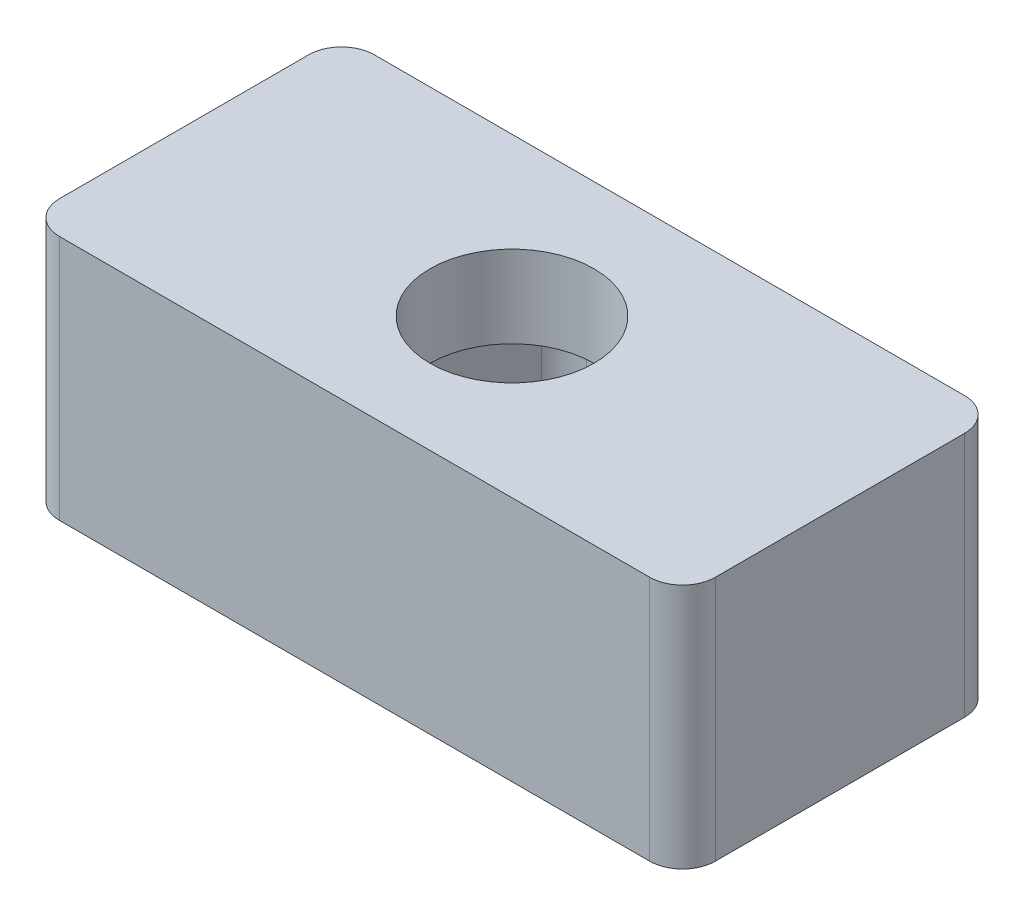
ISO-10303-21;
HEADER;
FILE_DESCRIPTION(('STEP AP214'),'2;1');
FILE_NAME('part.step','',(''),(''),'','','');
FILE_SCHEMA(('AUTOMOTIVE_DESIGN { 1 0 10303 214 1 1 1 1 }'));
ENDSEC;
DATA;
#1=APPLICATION_CONTEXT('core data for automotive mechanical design processes');
#2=APPLICATION_PROTOCOL_DEFINITION('international standard','automotive_design',2000,#1);
#3=PRODUCT_CONTEXT('',#1,'mechanical');
#4=PRODUCT('Part','Part','',(#3));
#5=PRODUCT_RELATED_PRODUCT_CATEGORY('part','',(#4));
#6=PRODUCT_DEFINITION_FORMATION('','',#4);
#7=PRODUCT_DEFINITION_CONTEXT('part definition',#1,'design');
#8=PRODUCT_DEFINITION('design','',#6,#7);
#9=PRODUCT_DEFINITION_SHAPE('','',#8);
#10=(LENGTH_UNIT() NAMED_UNIT(*) SI_UNIT(.MILLI.,.METRE.));
#11=(NAMED_UNIT(*) PLANE_ANGLE_UNIT() SI_UNIT($,.RADIAN.));
#12=(NAMED_UNIT(*) SI_UNIT($,.STERADIAN.) SOLID_ANGLE_UNIT());
#13=UNCERTAINTY_MEASURE_WITH_UNIT(LENGTH_MEASURE(1.E-05),#10,'distance_accuracy_value','');
#14=(GEOMETRIC_REPRESENTATION_CONTEXT(3) GLOBAL_UNCERTAINTY_ASSIGNED_CONTEXT((#13)) GLOBAL_UNIT_ASSIGNED_CONTEXT((#10,
#11,#12)) REPRESENTATION_CONTEXT('',''));
#15=CARTESIAN_POINT('',(0.,0.,0.));
#16=DIRECTION('',(0.,0.,1.));
#17=DIRECTION('',(1.,0.,0.));
#18=AXIS2_PLACEMENT_3D('',#15,#16,#17);
#19=CARTESIAN_POINT('',(0.,0.,0.));
#20=DIRECTION('',(0.,1.,0.));
#21=DIRECTION('',(0.,0.,1.));
#22=AXIS2_PLACEMENT_3D('',#19,#20,#21);
#23=PLANE('',#22);
#24=DIRECTION('',(0.,0.,1.));
#25=VECTOR('',#24,1.);
#26=CARTESIAN_POINT('',(-10.,0.,-4.8));
#27=LINE('',#26,#25);
#28=CARTESIAN_POINT('',(-10.,0.,-3.8));
#29=VERTEX_POINT('',#28);
#30=CARTESIAN_POINT('',(-10.,0.,3.8));
#31=VERTEX_POINT('',#30);
#32=EDGE_CURVE('E201',#29,#31,#27,.T.);
#33=ORIENTED_EDGE('',*,*,#32,.F.);
#34=CARTESIAN_POINT('',(-9.00000000000001,0.,-3.8));
#35=DIRECTION('',(0.,1.,0.));
#36=DIRECTION('',(0.,0.,1.));
#37=AXIS2_PLACEMENT_3D('',#34,#35,#36);
#38=CIRCLE('',#37,1.);
#39=CARTESIAN_POINT('',(-9.00000000000001,0.,-4.8));
#40=VERTEX_POINT('',#39);
#41=EDGE_CURVE('E250',#29,#40,#38,.F.);
#42=ORIENTED_EDGE('',*,*,#41,.T.);
#43=DIRECTION('',(-1.,0.,0.));
#44=VECTOR('',#43,1.);
#45=CARTESIAN_POINT('',(-10.,0.,-4.8));
#46=LINE('',#45,#44);
#47=CARTESIAN_POINT('',(8.99999999999999,0.,-4.8));
#48=VERTEX_POINT('',#47);
#49=EDGE_CURVE('E330',#48,#40,#46,.T.);
#50=ORIENTED_EDGE('',*,*,#49,.F.);
#51=CARTESIAN_POINT('',(8.99999999999999,0.,-3.8));
#52=DIRECTION('',(0.,1.,0.));
#53=DIRECTION('',(0.,0.,1.));
#54=AXIS2_PLACEMENT_3D('',#51,#52,#53);
#55=CIRCLE('',#54,1.);
#56=CARTESIAN_POINT('',(9.99999999999999,0.,-3.8));
#57=VERTEX_POINT('',#56);
#58=EDGE_CURVE('E248',#48,#57,#55,.F.);
#59=ORIENTED_EDGE('',*,*,#58,.T.);
#60=DIRECTION('',(0.,0.,-1.));
#61=VECTOR('',#60,1.);
#62=CARTESIAN_POINT('',(9.99999999999999,0.,-4.8));
#63=LINE('',#62,#61);
#64=CARTESIAN_POINT('',(9.99999999999999,0.,3.8));
#65=VERTEX_POINT('',#64);
#66=EDGE_CURVE('E320',#65,#57,#63,.T.);
#67=ORIENTED_EDGE('',*,*,#66,.F.);
#68=CARTESIAN_POINT('',(8.99999999999999,0.,3.8));
#69=DIRECTION('',(0.,1.,0.));
#70=DIRECTION('',(0.,0.,1.));
#71=AXIS2_PLACEMENT_3D('',#68,#69,#70);
#72=CIRCLE('',#71,1.);
#73=CARTESIAN_POINT('',(8.99999999999999,0.,4.8));
#74=VERTEX_POINT('',#73);
#75=EDGE_CURVE('E246',#65,#74,#72,.F.);
#76=ORIENTED_EDGE('',*,*,#75,.T.);
#77=DIRECTION('',(1.,0.,0.));
#78=VECTOR('',#77,1.);
#79=CARTESIAN_POINT('',(-10.,0.,4.8));
#80=LINE('',#79,#78);
#81=CARTESIAN_POINT('',(-9.,0.,4.8));
#82=VERTEX_POINT('',#81);
#83=EDGE_CURVE('E196',#82,#74,#80,.T.);
#84=ORIENTED_EDGE('',*,*,#83,.F.);
#85=CARTESIAN_POINT('',(-9.,0.,3.8));
#86=DIRECTION('',(0.,1.,0.));
#87=DIRECTION('',(0.,0.,1.));
#88=AXIS2_PLACEMENT_3D('',#85,#86,#87);
#89=CIRCLE('',#88,1.);
#90=EDGE_CURVE('E244',#82,#31,#89,.F.);
#91=ORIENTED_EDGE('',*,*,#90,.T.);
#92=EDGE_LOOP('',(#33,#42,#50,#59,#67,#76,#84,#91));
#93=FACE_BOUND('',#92,.T.);
#94=DIRECTION('',(1.,0.,0.));
#95=VECTOR('',#94,1.);
#96=CARTESIAN_POINT('',(-2.30940107675846,0.,4.00000000000001));
#97=LINE('',#96,#95);
#98=CARTESIAN_POINT('',(-1.73205080756883,0.,4.));
#99=VERTEX_POINT('',#98);
#100=CARTESIAN_POINT('',(1.73205080756891,0.,3.99999999999996));
#101=VERTEX_POINT('',#100);
#102=EDGE_CURVE('E173',#99,#101,#97,.T.);
#103=ORIENTED_EDGE('',*,*,#102,.T.);
#104=CARTESIAN_POINT('',(1.73205080756891,0.,2.99999999999996));
#105=DIRECTION('',(0.,1.,0.));
#106=DIRECTION('',(0.,0.,1.));
#107=AXIS2_PLACEMENT_3D('',#104,#105,#106);
#108=CIRCLE('',#107,1.);
#109=CARTESIAN_POINT('',(2.59807621135335,0.,3.49999999999996));
#110=VERTEX_POINT('',#109);
#111=EDGE_CURVE('E181',#101,#110,#108,.T.);
#112=ORIENTED_EDGE('',*,*,#111,.T.);
#113=DIRECTION('',(0.499999999999995,0.,-0.866025403784442));
#114=VECTOR('',#113,1.);
#115=CARTESIAN_POINT('',(2.30940107675854,0.,3.99999999999996));
#116=LINE('',#115,#114);
#117=CARTESIAN_POINT('',(4.33012701892218,0.,0.499999999999997));
#118=VERTEX_POINT('',#117);
#119=EDGE_CURVE('E321',#110,#118,#116,.T.);
#120=ORIENTED_EDGE('',*,*,#119,.T.);
#121=CARTESIAN_POINT('',(3.46410161513774,0.,0.));
#122=DIRECTION('',(0.,1.,0.));
#123=DIRECTION('',(0.,0.,1.));
#124=AXIS2_PLACEMENT_3D('',#121,#122,#123);
#125=CIRCLE('',#124,1.);
#126=CARTESIAN_POINT('',(4.33012701892217,0.,-0.499999999999998));
#127=VERTEX_POINT('',#126);
#128=EDGE_CURVE('E11',#118,#127,#125,.T.);
#129=ORIENTED_EDGE('',*,*,#128,.T.);
#130=DIRECTION('',(-0.500000000000001,0.,-0.866025403784438));
#131=VECTOR('',#130,1.);
#132=CARTESIAN_POINT('',(4.61880215351699,0.,0.));
#133=LINE('',#132,#131);
#134=CARTESIAN_POINT('',(2.5980762113533,0.,-3.49999999999999));
#135=VERTEX_POINT('',#134);
#136=EDGE_CURVE('E281',#127,#135,#133,.T.);
#137=ORIENTED_EDGE('',*,*,#136,.T.);
#138=CARTESIAN_POINT('',(1.73205080756886,0.,-2.99999999999999));
#139=DIRECTION('',(0.,1.,0.));
#140=DIRECTION('',(0.,0.,1.));
#141=AXIS2_PLACEMENT_3D('',#138,#139,#140);
#142=CIRCLE('',#141,1.);
#143=CARTESIAN_POINT('',(1.73205080756886,0.,-3.99999999999999));
#144=VERTEX_POINT('',#143);
#145=EDGE_CURVE('E41',#135,#144,#142,.T.);
#146=ORIENTED_EDGE('',*,*,#145,.T.);
#147=DIRECTION('',(-1.,0.,0.));
#148=VECTOR('',#147,1.);
#149=CARTESIAN_POINT('',(2.30940107675848,0.,-3.99999999999999));
#150=LINE('',#149,#148);
#151=CARTESIAN_POINT('',(-1.73205080756889,0.,-3.99999999999998));
#152=VERTEX_POINT('',#151);
#153=EDGE_CURVE('E279',#144,#152,#150,.T.);
#154=ORIENTED_EDGE('',*,*,#153,.T.);
#155=CARTESIAN_POINT('',(-1.73205080756889,0.,-2.99999999999998));
#156=DIRECTION('',(0.,1.,0.));
#157=DIRECTION('',(0.,0.,1.));
#158=AXIS2_PLACEMENT_3D('',#155,#156,#157);
#159=CIRCLE('',#158,1.);
#160=CARTESIAN_POINT('',(-2.59807621135333,0.,-3.49999999999997));
#161=VERTEX_POINT('',#160);
#162=EDGE_CURVE('E275',#152,#161,#159,.T.);
#163=ORIENTED_EDGE('',*,*,#162,.T.);
#164=DIRECTION('',(-0.499999999999995,0.,0.866025403784442));
#165=VECTOR('',#164,1.);
#166=CARTESIAN_POINT('',(-2.30940107675852,0.,-3.99999999999998));
#167=LINE('',#166,#165);
#168=CARTESIAN_POINT('',(-4.33012701892218,0.,-0.499999999999971));
#169=VERTEX_POINT('',#168);
#170=EDGE_CURVE('E290',#161,#169,#167,.T.);
#171=ORIENTED_EDGE('',*,*,#170,.T.);
#172=CARTESIAN_POINT('',(-3.46410161513774,0.,0.));
#173=DIRECTION('',(0.,1.,0.));
#174=DIRECTION('',(0.,0.,1.));
#175=AXIS2_PLACEMENT_3D('',#172,#173,#174);
#176=CIRCLE('',#175,1.);
#177=CARTESIAN_POINT('',(-4.33012701892217,0.,0.500000000000031));
#178=VERTEX_POINT('',#177);
#179=EDGE_CURVE('E180',#169,#178,#176,.T.);
#180=ORIENTED_EDGE('',*,*,#179,.T.);
#181=DIRECTION('',(0.500000000000007,0.,0.866025403784435));
#182=VECTOR('',#181,1.);
#183=CARTESIAN_POINT('',(-4.61880215351699,0.,0.));
#184=LINE('',#183,#182);
#185=CARTESIAN_POINT('',(-2.59807621135328,0.,3.50000000000001));
#186=VERTEX_POINT('',#185);
#187=EDGE_CURVE('E175',#178,#186,#184,.T.);
#188=ORIENTED_EDGE('',*,*,#187,.T.);
#189=CARTESIAN_POINT('',(-1.73205080756884,0.,3.));
#190=DIRECTION('',(0.,1.,0.));
#191=DIRECTION('',(0.,0.,1.));
#192=AXIS2_PLACEMENT_3D('',#189,#190,#191);
#193=CIRCLE('',#192,1.);
#194=EDGE_CURVE('E171',#186,#99,#193,.T.);
#195=ORIENTED_EDGE('',*,*,#194,.T.);
#196=EDGE_LOOP('',(#103,#112,#120,#129,#137,#146,#154,#163,#171,#180,#188,#195));
#197=FACE_BOUND('',#196,.T.);
#198=ADVANCED_FACE('F33',(#93,#197),#23,.F.);
#199=CARTESIAN_POINT('',(9.99999999999999,5.,-4.8));
#200=DIRECTION('',(-1.,0.,0.));
#201=DIRECTION('',(0.,0.,1.));
#202=AXIS2_PLACEMENT_3D('',#199,#200,#201);
#203=PLANE('',#202);
#204=ORIENTED_EDGE('',*,*,#66,.T.);
#205=DIRECTION('',(0.,-1.,0.));
#206=VECTOR('',#205,1.);
#207=CARTESIAN_POINT('',(9.99999999999999,5.,-3.8));
#208=LINE('',#207,#206);
#209=CARTESIAN_POINT('',(9.99999999999999,7.5,-3.8));
#210=VERTEX_POINT('',#209);
#211=EDGE_CURVE('E48',#57,#210,#208,.F.);
#212=ORIENTED_EDGE('',*,*,#211,.T.);
#213=DIRECTION('',(0.,0.,-1.));
#214=VECTOR('',#213,1.);
#215=CARTESIAN_POINT('',(9.99999999999999,7.5,-4.8));
#216=LINE('',#215,#214);
#217=CARTESIAN_POINT('',(9.99999999999999,7.5,3.8));
#218=VERTEX_POINT('',#217);
#219=EDGE_CURVE('E354',#218,#210,#216,.T.);
#220=ORIENTED_EDGE('',*,*,#219,.F.);
#221=DIRECTION('',(0.,-1.,0.));
#222=VECTOR('',#221,1.);
#223=CARTESIAN_POINT('',(9.99999999999999,5.,3.8));
#224=LINE('',#223,#222);
#225=EDGE_CURVE('E264',#218,#65,#224,.T.);
#226=ORIENTED_EDGE('',*,*,#225,.T.);
#227=EDGE_LOOP('',(#204,#212,#220,#226));
#228=FACE_BOUND('',#227,.T.);
#229=ADVANCED_FACE('F373',(#228),#203,.F.);
#230=CARTESIAN_POINT('',(-10.,5.,-4.8));
#231=DIRECTION('',(0.,0.,1.));
#232=DIRECTION('',(1.,0.,0.));
#233=AXIS2_PLACEMENT_3D('',#230,#231,#232);
#234=PLANE('',#233);
#235=ORIENTED_EDGE('',*,*,#49,.T.);
#236=DIRECTION('',(0.,-1.,0.));
#237=VECTOR('',#236,1.);
#238=CARTESIAN_POINT('',(-9.00000000000001,5.,-4.8));
#239=LINE('',#238,#237);
#240=CARTESIAN_POINT('',(-9.00000000000001,7.5,-4.8));
#241=VERTEX_POINT('',#240);
#242=EDGE_CURVE('E255',#40,#241,#239,.F.);
#243=ORIENTED_EDGE('',*,*,#242,.T.);
#244=DIRECTION('',(-1.,0.,0.));
#245=VECTOR('',#244,1.);
#246=CARTESIAN_POINT('',(-10.,7.5,-4.8));
#247=LINE('',#246,#245);
#248=CARTESIAN_POINT('',(8.99999999999999,7.5,-4.8));
#249=VERTEX_POINT('',#248);
#250=EDGE_CURVE('E324',#249,#241,#247,.T.);
#251=ORIENTED_EDGE('',*,*,#250,.F.);
#252=DIRECTION('',(0.,-1.,0.));
#253=VECTOR('',#252,1.);
#254=CARTESIAN_POINT('',(8.99999999999999,5.,-4.8));
#255=LINE('',#254,#253);
#256=EDGE_CURVE('E252',#249,#48,#255,.T.);
#257=ORIENTED_EDGE('',*,*,#256,.T.);
#258=EDGE_LOOP('',(#235,#243,#251,#257));
#259=FACE_BOUND('',#258,.T.);
#260=ADVANCED_FACE('F369',(#259),#234,.F.);
#261=CARTESIAN_POINT('',(-10.,5.,-4.8));
#262=DIRECTION('',(1.,0.,0.));
#263=DIRECTION('',(0.,0.,-1.));
#264=AXIS2_PLACEMENT_3D('',#261,#262,#263);
#265=PLANE('',#264);
#266=DIRECTION('',(0.,0.,1.));
#267=VECTOR('',#266,1.);
#268=CARTESIAN_POINT('',(-10.,7.5,-4.8));
#269=LINE('',#268,#267);
#270=CARTESIAN_POINT('',(-10.,7.5,-3.8));
#271=VERTEX_POINT('',#270);
#272=CARTESIAN_POINT('',(-10.,7.5,3.8));
#273=VERTEX_POINT('',#272);
#274=EDGE_CURVE('E349',#271,#273,#269,.T.);
#275=ORIENTED_EDGE('',*,*,#274,.F.);
#276=DIRECTION('',(0.,-1.,0.));
#277=VECTOR('',#276,1.);
#278=CARTESIAN_POINT('',(-10.,5.,-3.8));
#279=LINE('',#278,#277);
#280=EDGE_CURVE('E241',#271,#29,#279,.T.);
#281=ORIENTED_EDGE('',*,*,#280,.T.);
#282=ORIENTED_EDGE('',*,*,#32,.T.);
#283=DIRECTION('',(0.,-1.,0.));
#284=VECTOR('',#283,1.);
#285=CARTESIAN_POINT('',(-10.,5.,3.8));
#286=LINE('',#285,#284);
#287=EDGE_CURVE('E239',#31,#273,#286,.F.);
#288=ORIENTED_EDGE('',*,*,#287,.T.);
#289=EDGE_LOOP('',(#275,#281,#282,#288));
#290=FACE_BOUND('',#289,.T.);
#291=ADVANCED_FACE('F337',(#290),#265,.F.);
#292=CARTESIAN_POINT('',(-10.,5.,4.8));
#293=DIRECTION('',(0.,0.,-1.));
#294=DIRECTION('',(-1.,0.,0.));
#295=AXIS2_PLACEMENT_3D('',#292,#293,#294);
#296=PLANE('',#295);
#297=ORIENTED_EDGE('',*,*,#83,.T.);
#298=DIRECTION('',(0.,-1.,0.));
#299=VECTOR('',#298,1.);
#300=CARTESIAN_POINT('',(8.99999999999999,5.,4.8));
#301=LINE('',#300,#299);
#302=CARTESIAN_POINT('',(8.99999999999999,7.5,4.8));
#303=VERTEX_POINT('',#302);
#304=EDGE_CURVE('E271',#74,#303,#301,.F.);
#305=ORIENTED_EDGE('',*,*,#304,.T.);
#306=DIRECTION('',(1.,0.,0.));
#307=VECTOR('',#306,1.);
#308=CARTESIAN_POINT('',(-10.,7.5,4.8));
#309=LINE('',#308,#307);
#310=CARTESIAN_POINT('',(-9.,7.5,4.8));
#311=VERTEX_POINT('',#310);
#312=EDGE_CURVE('E348',#311,#303,#309,.T.);
#313=ORIENTED_EDGE('',*,*,#312,.F.);
#314=DIRECTION('',(0.,-1.,0.));
#315=VECTOR('',#314,1.);
#316=CARTESIAN_POINT('',(-9.,5.,4.8));
#317=LINE('',#316,#315);
#318=EDGE_CURVE('E268',#311,#82,#317,.T.);
#319=ORIENTED_EDGE('',*,*,#318,.T.);
#320=EDGE_LOOP('',(#297,#305,#313,#319));
#321=FACE_BOUND('',#320,.T.);
#322=ADVANCED_FACE('F351',(#321),#296,.F.);
#323=CARTESIAN_POINT('',(2.30940107675854,5.,3.99999999999996));
#324=DIRECTION('',(-0.866025403784442,0.,-0.499999999999995));
#325=DIRECTION('',(-0.499999999999995,0.,0.866025403784442));
#326=AXIS2_PLACEMENT_3D('',#323,#324,#325);
#327=PLANE('',#326);
#328=ORIENTED_EDGE('',*,*,#119,.F.);
#329=DIRECTION('',(0.,-1.,0.));
#330=VECTOR('',#329,1.);
#331=CARTESIAN_POINT('',(2.59807621135335,5.,3.49999999999996));
#332=LINE('',#331,#330);
#333=CARTESIAN_POINT('',(2.59807621135335,5.,3.49999999999996));
#334=VERTEX_POINT('',#333);
#335=EDGE_CURVE('E207',#110,#334,#332,.F.);
#336=ORIENTED_EDGE('',*,*,#335,.T.);
#337=DIRECTION('',(0.499999999999995,0.,-0.866025403784442));
#338=VECTOR('',#337,1.);
#339=CARTESIAN_POINT('',(2.30940107675854,5.,3.99999999999996));
#340=LINE('',#339,#338);
#341=CARTESIAN_POINT('',(4.33012701892218,5.,0.499999999999997));
#342=VERTEX_POINT('',#341);
#343=EDGE_CURVE('E191',#334,#342,#340,.T.);
#344=ORIENTED_EDGE('',*,*,#343,.T.);
#345=DIRECTION('',(0.,-1.,0.));
#346=VECTOR('',#345,1.);
#347=CARTESIAN_POINT('',(4.33012701892218,0.,0.499999999999999));
#348=LINE('',#347,#346);
#349=EDGE_CURVE('E198',#342,#118,#348,.T.);
#350=ORIENTED_EDGE('',*,*,#349,.T.);
#351=EDGE_LOOP('',(#328,#336,#344,#350));
#352=FACE_BOUND('',#351,.T.);
#353=ADVANCED_FACE('F391',(#352),#327,.T.);
#354=CARTESIAN_POINT('',(4.61880215351699,5.,0.));
#355=DIRECTION('',(-0.866025403784438,0.,0.500000000000001));
#356=DIRECTION('',(0.500000000000001,0.,0.866025403784438));
#357=AXIS2_PLACEMENT_3D('',#354,#355,#356);
#358=PLANE('',#357);
#359=DIRECTION('',(-0.500000000000001,0.,-0.866025403784438));
#360=VECTOR('',#359,1.);
#361=CARTESIAN_POINT('',(4.61880215351699,5.,0.));
#362=LINE('',#361,#360);
#363=CARTESIAN_POINT('',(4.33012701892217,5.,-0.499999999999998));
#364=VERTEX_POINT('',#363);
#365=CARTESIAN_POINT('',(2.5980762113533,5.,-3.49999999999999));
#366=VERTEX_POINT('',#365);
#367=EDGE_CURVE('E300',#364,#366,#362,.T.);
#368=ORIENTED_EDGE('',*,*,#367,.T.);
#369=DIRECTION('',(0.,-1.,0.));
#370=VECTOR('',#369,1.);
#371=CARTESIAN_POINT('',(2.5980762113533,0.,-3.49999999999999));
#372=LINE('',#371,#370);
#373=EDGE_CURVE('E236',#366,#135,#372,.T.);
#374=ORIENTED_EDGE('',*,*,#373,.T.);
#375=ORIENTED_EDGE('',*,*,#136,.F.);
#376=DIRECTION('',(0.,-1.,0.));
#377=VECTOR('',#376,1.);
#378=CARTESIAN_POINT('',(4.33012701892217,5.,-0.499999999999998));
#379=LINE('',#378,#377);
#380=EDGE_CURVE('E234',#127,#364,#379,.F.);
#381=ORIENTED_EDGE('',*,*,#380,.T.);
#382=EDGE_LOOP('',(#368,#374,#375,#381));
#383=FACE_BOUND('',#382,.T.);
#384=ADVANCED_FACE('F304',(#383),#358,.T.);
#385=CARTESIAN_POINT('',(2.30940107675848,5.,-3.99999999999999));
#386=DIRECTION('',(0.,0.,1.));
#387=DIRECTION('',(1.,0.,0.));
#388=AXIS2_PLACEMENT_3D('',#385,#386,#387);
#389=PLANE('',#388);
#390=DIRECTION('',(-1.,0.,0.));
#391=VECTOR('',#390,1.);
#392=CARTESIAN_POINT('',(2.30940107675848,5.,-3.99999999999999));
#393=LINE('',#392,#391);
#394=CARTESIAN_POINT('',(1.73205080756886,5.,-3.99999999999999));
#395=VERTEX_POINT('',#394);
#396=CARTESIAN_POINT('',(-1.73205080756889,5.,-3.99999999999998));
#397=VERTEX_POINT('',#396);
#398=EDGE_CURVE('E302',#395,#397,#393,.T.);
#399=ORIENTED_EDGE('',*,*,#398,.T.);
#400=DIRECTION('',(0.,-1.,0.));
#401=VECTOR('',#400,1.);
#402=CARTESIAN_POINT('',(-1.73205080756889,0.,-3.99999999999998));
#403=LINE('',#402,#401);
#404=EDGE_CURVE('E231',#397,#152,#403,.T.);
#405=ORIENTED_EDGE('',*,*,#404,.T.);
#406=ORIENTED_EDGE('',*,*,#153,.F.);
#407=DIRECTION('',(0.,-1.,0.));
#408=VECTOR('',#407,1.);
#409=CARTESIAN_POINT('',(1.73205080756886,5.,-3.99999999999999));
#410=LINE('',#409,#408);
#411=EDGE_CURVE('E229',#144,#395,#410,.F.);
#412=ORIENTED_EDGE('',*,*,#411,.T.);
#413=EDGE_LOOP('',(#399,#405,#406,#412));
#414=FACE_BOUND('',#413,.T.);
#415=ADVANCED_FACE('F287',(#414),#389,.T.);
#416=CARTESIAN_POINT('',(-2.30940107675852,5.,-3.99999999999998));
#417=DIRECTION('',(0.866025403784442,0.,0.499999999999995));
#418=DIRECTION('',(0.499999999999995,0.,-0.866025403784442));
#419=AXIS2_PLACEMENT_3D('',#416,#417,#418);
#420=PLANE('',#419);
#421=DIRECTION('',(-0.499999999999995,0.,0.866025403784442));
#422=VECTOR('',#421,1.);
#423=CARTESIAN_POINT('',(-2.30940107675852,5.,-3.99999999999998));
#424=LINE('',#423,#422);
#425=CARTESIAN_POINT('',(-2.59807621135333,5.,-3.49999999999997));
#426=VERTEX_POINT('',#425);
#427=CARTESIAN_POINT('',(-4.33012701892218,5.,-0.499999999999971));
#428=VERTEX_POINT('',#427);
#429=EDGE_CURVE('E307',#426,#428,#424,.T.);
#430=ORIENTED_EDGE('',*,*,#429,.T.);
#431=DIRECTION('',(0.,-1.,0.));
#432=VECTOR('',#431,1.);
#433=CARTESIAN_POINT('',(-4.33012701892218,0.,-0.499999999999971));
#434=LINE('',#433,#432);
#435=EDGE_CURVE('E226',#428,#169,#434,.T.);
#436=ORIENTED_EDGE('',*,*,#435,.T.);
#437=ORIENTED_EDGE('',*,*,#170,.F.);
#438=DIRECTION('',(0.,-1.,0.));
#439=VECTOR('',#438,1.);
#440=CARTESIAN_POINT('',(-2.59807621135333,5.,-3.49999999999997));
#441=LINE('',#440,#439);
#442=EDGE_CURVE('E224',#161,#426,#441,.F.);
#443=ORIENTED_EDGE('',*,*,#442,.T.);
#444=EDGE_LOOP('',(#430,#436,#437,#443));
#445=FACE_BOUND('',#444,.T.);
#446=ADVANCED_FACE('F545',(#445),#420,.T.);
#447=CARTESIAN_POINT('',(-4.61880215351699,5.,0.));
#448=DIRECTION('',(0.866025403784435,0.,-0.500000000000007));
#449=DIRECTION('',(-0.500000000000007,0.,-0.866025403784435));
#450=AXIS2_PLACEMENT_3D('',#447,#448,#449);
#451=PLANE('',#450);
#452=DIRECTION('',(0.500000000000007,0.,0.866025403784435));
#453=VECTOR('',#452,1.);
#454=CARTESIAN_POINT('',(-4.61880215351699,5.,0.));
#455=LINE('',#454,#453);
#456=CARTESIAN_POINT('',(-4.33012701892217,5.,0.500000000000031));
#457=VERTEX_POINT('',#456);
#458=CARTESIAN_POINT('',(-2.59807621135328,5.,3.50000000000001));
#459=VERTEX_POINT('',#458);
#460=EDGE_CURVE('E315',#457,#459,#455,.T.);
#461=ORIENTED_EDGE('',*,*,#460,.T.);
#462=DIRECTION('',(0.,-1.,0.));
#463=VECTOR('',#462,1.);
#464=CARTESIAN_POINT('',(-2.59807621135328,0.,3.50000000000001));
#465=LINE('',#464,#463);
#466=EDGE_CURVE('E222',#459,#186,#465,.T.);
#467=ORIENTED_EDGE('',*,*,#466,.T.);
#468=ORIENTED_EDGE('',*,*,#187,.F.);
#469=DIRECTION('',(0.,-1.,0.));
#470=VECTOR('',#469,1.);
#471=CARTESIAN_POINT('',(-4.33012701892217,5.,0.500000000000031));
#472=LINE('',#471,#470);
#473=EDGE_CURVE('E220',#178,#457,#472,.F.);
#474=ORIENTED_EDGE('',*,*,#473,.T.);
#475=EDGE_LOOP('',(#461,#467,#468,#474));
#476=FACE_BOUND('',#475,.T.);
#477=ADVANCED_FACE('F537',(#476),#451,.T.);
#478=CARTESIAN_POINT('',(-2.30940107675846,5.,4.00000000000001));
#479=DIRECTION('',(0.,0.,-1.));
#480=DIRECTION('',(-1.,0.,0.));
#481=AXIS2_PLACEMENT_3D('',#478,#479,#480);
#482=PLANE('',#481);
#483=DIRECTION('',(1.,0.,0.));
#484=VECTOR('',#483,1.);
#485=CARTESIAN_POINT('',(-2.30940107675846,5.,4.00000000000001));
#486=LINE('',#485,#484);
#487=CARTESIAN_POINT('',(-1.73205080756883,5.,4.));
#488=VERTEX_POINT('',#487);
#489=CARTESIAN_POINT('',(1.73205080756891,5.,3.99999999999996));
#490=VERTEX_POINT('',#489);
#491=EDGE_CURVE('E318',#488,#490,#486,.T.);
#492=ORIENTED_EDGE('',*,*,#491,.T.);
#493=DIRECTION('',(0.,-1.,0.));
#494=VECTOR('',#493,1.);
#495=CARTESIAN_POINT('',(1.73205080756892,0.,3.99999999999996));
#496=LINE('',#495,#494);
#497=EDGE_CURVE('E190',#490,#101,#496,.T.);
#498=ORIENTED_EDGE('',*,*,#497,.T.);
#499=ORIENTED_EDGE('',*,*,#102,.F.);
#500=DIRECTION('',(0.,-1.,0.));
#501=VECTOR('',#500,1.);
#502=CARTESIAN_POINT('',(-1.73205080756883,5.,4.));
#503=LINE('',#502,#501);
#504=EDGE_CURVE('E187',#99,#488,#503,.F.);
#505=ORIENTED_EDGE('',*,*,#504,.T.);
#506=EDGE_LOOP('',(#492,#498,#499,#505));
#507=FACE_BOUND('',#506,.T.);
#508=ADVANCED_FACE('F186',(#507),#482,.T.);
#509=CARTESIAN_POINT('',(0.,7.5,0.));
#510=DIRECTION('',(0.,1.,0.));
#511=DIRECTION('',(0.,0.,1.));
#512=AXIS2_PLACEMENT_3D('',#509,#510,#511);
#513=PLANE('',#512);
#514=ORIENTED_EDGE('',*,*,#250,.T.);
#515=CARTESIAN_POINT('',(-9.00000000000001,7.5,-3.8));
#516=DIRECTION('',(0.,1.,0.));
#517=DIRECTION('',(0.,0.,1.));
#518=AXIS2_PLACEMENT_3D('',#515,#516,#517);
#519=CIRCLE('',#518,1.);
#520=EDGE_CURVE('E262',#241,#271,#519,.T.);
#521=ORIENTED_EDGE('',*,*,#520,.T.);
#522=ORIENTED_EDGE('',*,*,#274,.T.);
#523=CARTESIAN_POINT('',(-9.,7.5,3.8));
#524=DIRECTION('',(0.,1.,0.));
#525=DIRECTION('',(0.,0.,1.));
#526=AXIS2_PLACEMENT_3D('',#523,#524,#525);
#527=CIRCLE('',#526,1.);
#528=EDGE_CURVE('E257',#273,#311,#527,.T.);
#529=ORIENTED_EDGE('',*,*,#528,.T.);
#530=ORIENTED_EDGE('',*,*,#312,.T.);
#531=CARTESIAN_POINT('',(8.99999999999999,7.5,3.8));
#532=DIRECTION('',(0.,1.,0.));
#533=DIRECTION('',(0.,0.,1.));
#534=AXIS2_PLACEMENT_3D('',#531,#532,#533);
#535=CIRCLE('',#534,1.);
#536=EDGE_CURVE('E55',#303,#218,#535,.T.);
#537=ORIENTED_EDGE('',*,*,#536,.T.);
#538=ORIENTED_EDGE('',*,*,#219,.T.);
#539=CARTESIAN_POINT('',(8.99999999999999,7.5,-3.8));
#540=DIRECTION('',(0.,1.,0.));
#541=DIRECTION('',(0.,0.,1.));
#542=AXIS2_PLACEMENT_3D('',#539,#540,#541);
#543=CIRCLE('',#542,1.);
#544=EDGE_CURVE('E260',#210,#249,#543,.T.);
#545=ORIENTED_EDGE('',*,*,#544,.T.);
#546=EDGE_LOOP('',(#514,#521,#522,#529,#530,#537,#538,#545));
#547=FACE_BOUND('',#546,.T.);
#548=CARTESIAN_POINT('',(0.,7.5,0.));
#549=DIRECTION('',(0.,1.,0.));
#550=DIRECTION('',(0.,0.,1.));
#551=AXIS2_PLACEMENT_3D('',#548,#549,#550);
#552=CIRCLE('',#551,2.5);
#553=CARTESIAN_POINT('',(0.,7.5,2.5));
#554=VERTEX_POINT('',#553);
#555=EDGE_CURVE('E357',#554,#554,#552,.T.);
#556=ORIENTED_EDGE('',*,*,#555,.F.);
#557=EDGE_LOOP('',(#556));
#558=FACE_BOUND('',#557,.T.);
#559=ADVANCED_FACE('F346',(#547,#558),#513,.T.);
#560=CARTESIAN_POINT('',(0.,5.,0.));
#561=DIRECTION('',(0.,1.,0.));
#562=DIRECTION('',(0.,0.,1.));
#563=AXIS2_PLACEMENT_3D('',#560,#561,#562);
#564=PLANE('',#563);
#565=ORIENTED_EDGE('',*,*,#343,.F.);
#566=CARTESIAN_POINT('',(1.73205080756891,5.,2.99999999999996));
#567=DIRECTION('',(0.,1.,0.));
#568=DIRECTION('',(0.,0.,1.));
#569=AXIS2_PLACEMENT_3D('',#566,#567,#568);
#570=CIRCLE('',#569,1.);
#571=EDGE_CURVE('E218',#334,#490,#570,.F.);
#572=ORIENTED_EDGE('',*,*,#571,.T.);
#573=ORIENTED_EDGE('',*,*,#491,.F.);
#574=CARTESIAN_POINT('',(-1.73205080756884,5.,3.));
#575=DIRECTION('',(0.,1.,0.));
#576=DIRECTION('',(0.,0.,1.));
#577=AXIS2_PLACEMENT_3D('',#574,#575,#576);
#578=CIRCLE('',#577,1.);
#579=EDGE_CURVE('E195',#488,#459,#578,.F.);
#580=ORIENTED_EDGE('',*,*,#579,.T.);
#581=ORIENTED_EDGE('',*,*,#460,.F.);
#582=CARTESIAN_POINT('',(-3.46410161513774,5.,0.));
#583=DIRECTION('',(0.,1.,0.));
#584=DIRECTION('',(0.,0.,1.));
#585=AXIS2_PLACEMENT_3D('',#582,#583,#584);
#586=CIRCLE('',#585,1.);
#587=EDGE_CURVE('E215',#457,#428,#586,.F.);
#588=ORIENTED_EDGE('',*,*,#587,.T.);
#589=ORIENTED_EDGE('',*,*,#429,.F.);
#590=CARTESIAN_POINT('',(-1.73205080756889,5.,-2.99999999999998));
#591=DIRECTION('',(0.,1.,0.));
#592=DIRECTION('',(0.,0.,1.));
#593=AXIS2_PLACEMENT_3D('',#590,#591,#592);
#594=CIRCLE('',#593,1.);
#595=EDGE_CURVE('E213',#426,#397,#594,.F.);
#596=ORIENTED_EDGE('',*,*,#595,.T.);
#597=ORIENTED_EDGE('',*,*,#398,.F.);
#598=CARTESIAN_POINT('',(1.73205080756886,5.,-2.99999999999999));
#599=DIRECTION('',(0.,1.,0.));
#600=DIRECTION('',(0.,0.,1.));
#601=AXIS2_PLACEMENT_3D('',#598,#599,#600);
#602=CIRCLE('',#601,1.);
#603=EDGE_CURVE('E211',#395,#366,#602,.F.);
#604=ORIENTED_EDGE('',*,*,#603,.T.);
#605=ORIENTED_EDGE('',*,*,#367,.F.);
#606=CARTESIAN_POINT('',(3.46410161513774,5.,0.));
#607=DIRECTION('',(0.,1.,0.));
#608=DIRECTION('',(0.,0.,1.));
#609=AXIS2_PLACEMENT_3D('',#606,#607,#608);
#610=CIRCLE('',#609,1.);
#611=EDGE_CURVE('E209',#364,#342,#610,.F.);
#612=ORIENTED_EDGE('',*,*,#611,.T.);
#613=EDGE_LOOP('',(#565,#572,#573,#580,#581,#588,#589,#596,#597,#604,#605,#612));
#614=FACE_BOUND('',#613,.T.);
#615=CARTESIAN_POINT('',(0.,5.,0.));
#616=DIRECTION('',(0.,1.,0.));
#617=DIRECTION('',(0.,0.,1.));
#618=AXIS2_PLACEMENT_3D('',#615,#616,#617);
#619=CIRCLE('',#618,2.5);
#620=CARTESIAN_POINT('',(0.,5.,2.5));
#621=VERTEX_POINT('',#620);
#622=EDGE_CURVE('E612',#621,#621,#619,.T.);
#623=ORIENTED_EDGE('',*,*,#622,.T.);
#624=EDGE_LOOP('',(#623));
#625=FACE_BOUND('',#624,.T.);
#626=ADVANCED_FACE('F298',(#614,#625),#564,.F.);
#627=CARTESIAN_POINT('',(0.,7.5,0.));
#628=DIRECTION('',(0.,-1.,0.));
#629=DIRECTION('',(0.,0.,-1.));
#630=AXIS2_PLACEMENT_3D('',#627,#628,#629);
#631=CYLINDRICAL_SURFACE('',#630,2.5);
#632=ORIENTED_EDGE('',*,*,#555,.T.);
#633=EDGE_LOOP('',(#632));
#634=FACE_BOUND('',#633,.T.);
#635=ORIENTED_EDGE('',*,*,#622,.F.);
#636=EDGE_LOOP('',(#635));
#637=FACE_BOUND('',#636,.T.);
#638=ADVANCED_FACE('F402',(#634,#637),#631,.F.);
#639=CARTESIAN_POINT('',(1.73205080756891,5.,2.99999999999996));
#640=DIRECTION('',(0.,1.,0.));
#641=DIRECTION('',(0.,0.,1.));
#642=AXIS2_PLACEMENT_3D('',#639,#640,#641);
#643=CYLINDRICAL_SURFACE('',#642,1.);
#644=ORIENTED_EDGE('',*,*,#571,.F.);
#645=ORIENTED_EDGE('',*,*,#335,.F.);
#646=ORIENTED_EDGE('',*,*,#111,.F.);
#647=ORIENTED_EDGE('',*,*,#497,.F.);
#648=EDGE_LOOP('',(#644,#645,#646,#647));
#649=FACE_BOUND('',#648,.T.);
#650=ADVANCED_FACE('F399',(#649),#643,.F.);
#651=CARTESIAN_POINT('',(-1.73205080756884,5.,3.));
#652=DIRECTION('',(0.,1.,0.));
#653=DIRECTION('',(0.,0.,1.));
#654=AXIS2_PLACEMENT_3D('',#651,#652,#653);
#655=CYLINDRICAL_SURFACE('',#654,1.);
#656=ORIENTED_EDGE('',*,*,#579,.F.);
#657=ORIENTED_EDGE('',*,*,#504,.F.);
#658=ORIENTED_EDGE('',*,*,#194,.F.);
#659=ORIENTED_EDGE('',*,*,#466,.F.);
#660=EDGE_LOOP('',(#656,#657,#658,#659));
#661=FACE_BOUND('',#660,.T.);
#662=ADVANCED_FACE('F194',(#661),#655,.F.);
#663=CARTESIAN_POINT('',(-3.46410161513774,5.,0.));
#664=DIRECTION('',(0.,1.,0.));
#665=DIRECTION('',(0.,0.,1.));
#666=AXIS2_PLACEMENT_3D('',#663,#664,#665);
#667=CYLINDRICAL_SURFACE('',#666,1.);
#668=ORIENTED_EDGE('',*,*,#587,.F.);
#669=ORIENTED_EDGE('',*,*,#473,.F.);
#670=ORIENTED_EDGE('',*,*,#179,.F.);
#671=ORIENTED_EDGE('',*,*,#435,.F.);
#672=EDGE_LOOP('',(#668,#669,#670,#671));
#673=FACE_BOUND('',#672,.T.);
#674=ADVANCED_FACE('F406',(#673),#667,.F.);
#675=CARTESIAN_POINT('',(-1.73205080756889,5.,-2.99999999999998));
#676=DIRECTION('',(0.,1.,0.));
#677=DIRECTION('',(0.,0.,1.));
#678=AXIS2_PLACEMENT_3D('',#675,#676,#677);
#679=CYLINDRICAL_SURFACE('',#678,1.);
#680=ORIENTED_EDGE('',*,*,#595,.F.);
#681=ORIENTED_EDGE('',*,*,#442,.F.);
#682=ORIENTED_EDGE('',*,*,#162,.F.);
#683=ORIENTED_EDGE('',*,*,#404,.F.);
#684=EDGE_LOOP('',(#680,#681,#682,#683));
#685=FACE_BOUND('',#684,.T.);
#686=ADVANCED_FACE('F409',(#685),#679,.F.);
#687=CARTESIAN_POINT('',(1.73205080756886,5.,-2.99999999999999));
#688=DIRECTION('',(0.,1.,0.));
#689=DIRECTION('',(0.,0.,1.));
#690=AXIS2_PLACEMENT_3D('',#687,#688,#689);
#691=CYLINDRICAL_SURFACE('',#690,1.);
#692=ORIENTED_EDGE('',*,*,#603,.F.);
#693=ORIENTED_EDGE('',*,*,#411,.F.);
#694=ORIENTED_EDGE('',*,*,#145,.F.);
#695=ORIENTED_EDGE('',*,*,#373,.F.);
#696=EDGE_LOOP('',(#692,#693,#694,#695));
#697=FACE_BOUND('',#696,.T.);
#698=ADVANCED_FACE('F293',(#697),#691,.F.);
#699=CARTESIAN_POINT('',(3.46410161513774,5.,0.));
#700=DIRECTION('',(0.,1.,0.));
#701=DIRECTION('',(0.,0.,1.));
#702=AXIS2_PLACEMENT_3D('',#699,#700,#701);
#703=CYLINDRICAL_SURFACE('',#702,1.);
#704=ORIENTED_EDGE('',*,*,#611,.F.);
#705=ORIENTED_EDGE('',*,*,#380,.F.);
#706=ORIENTED_EDGE('',*,*,#128,.F.);
#707=ORIENTED_EDGE('',*,*,#349,.F.);
#708=EDGE_LOOP('',(#704,#705,#706,#707));
#709=FACE_BOUND('',#708,.T.);
#710=ADVANCED_FACE('F416',(#709),#703,.F.);
#711=CARTESIAN_POINT('',(-9.00000000000001,5.,-3.8));
#712=DIRECTION('',(0.,-1.,0.));
#713=DIRECTION('',(0.,0.,-1.));
#714=AXIS2_PLACEMENT_3D('',#711,#712,#713);
#715=CYLINDRICAL_SURFACE('',#714,1.);
#716=ORIENTED_EDGE('',*,*,#520,.F.);
#717=ORIENTED_EDGE('',*,*,#242,.F.);
#718=ORIENTED_EDGE('',*,*,#41,.F.);
#719=ORIENTED_EDGE('',*,*,#280,.F.);
#720=EDGE_LOOP('',(#716,#717,#718,#719));
#721=FACE_BOUND('',#720,.T.);
#722=ADVANCED_FACE('F367',(#721),#715,.T.);
#723=CARTESIAN_POINT('',(8.99999999999999,5.,-3.8));
#724=DIRECTION('',(0.,-1.,0.));
#725=DIRECTION('',(0.,0.,-1.));
#726=AXIS2_PLACEMENT_3D('',#723,#724,#725);
#727=CYLINDRICAL_SURFACE('',#726,1.);
#728=ORIENTED_EDGE('',*,*,#544,.F.);
#729=ORIENTED_EDGE('',*,*,#211,.F.);
#730=ORIENTED_EDGE('',*,*,#58,.F.);
#731=ORIENTED_EDGE('',*,*,#256,.F.);
#732=EDGE_LOOP('',(#728,#729,#730,#731));
#733=FACE_BOUND('',#732,.T.);
#734=ADVANCED_FACE('F371',(#733),#727,.T.);
#735=CARTESIAN_POINT('',(8.99999999999999,5.,3.8));
#736=DIRECTION('',(0.,-1.,0.));
#737=DIRECTION('',(0.,0.,-1.));
#738=AXIS2_PLACEMENT_3D('',#735,#736,#737);
#739=CYLINDRICAL_SURFACE('',#738,1.);
#740=ORIENTED_EDGE('',*,*,#536,.F.);
#741=ORIENTED_EDGE('',*,*,#304,.F.);
#742=ORIENTED_EDGE('',*,*,#75,.F.);
#743=ORIENTED_EDGE('',*,*,#225,.F.);
#744=EDGE_LOOP('',(#740,#741,#742,#743));
#745=FACE_BOUND('',#744,.T.);
#746=ADVANCED_FACE('F376',(#745),#739,.T.);
#747=CARTESIAN_POINT('',(-9.,5.,3.8));
#748=DIRECTION('',(0.,-1.,0.));
#749=DIRECTION('',(0.,0.,-1.));
#750=AXIS2_PLACEMENT_3D('',#747,#748,#749);
#751=CYLINDRICAL_SURFACE('',#750,1.);
#752=ORIENTED_EDGE('',*,*,#528,.F.);
#753=ORIENTED_EDGE('',*,*,#287,.F.);
#754=ORIENTED_EDGE('',*,*,#90,.F.);
#755=ORIENTED_EDGE('',*,*,#318,.F.);
#756=EDGE_LOOP('',(#752,#753,#754,#755));
#757=FACE_BOUND('',#756,.T.);
#758=ADVANCED_FACE('F35',(#757),#751,.T.);
#759=CLOSED_SHELL('',(#198,#229,#260,#291,#322,#353,#384,#415,#446,#477,#508,#559,#626,#638,
#650,#662,#674,#686,#698,#710,#722,#734,#746,#758));
#760=MANIFOLD_SOLID_BREP('B2',#759);
#761=ADVANCED_BREP_SHAPE_REPRESENTATION('',(#18,#760),#14);
#762=SHAPE_DEFINITION_REPRESENTATION(#9,#761);
ENDSEC;
END-ISO-10303-21;
